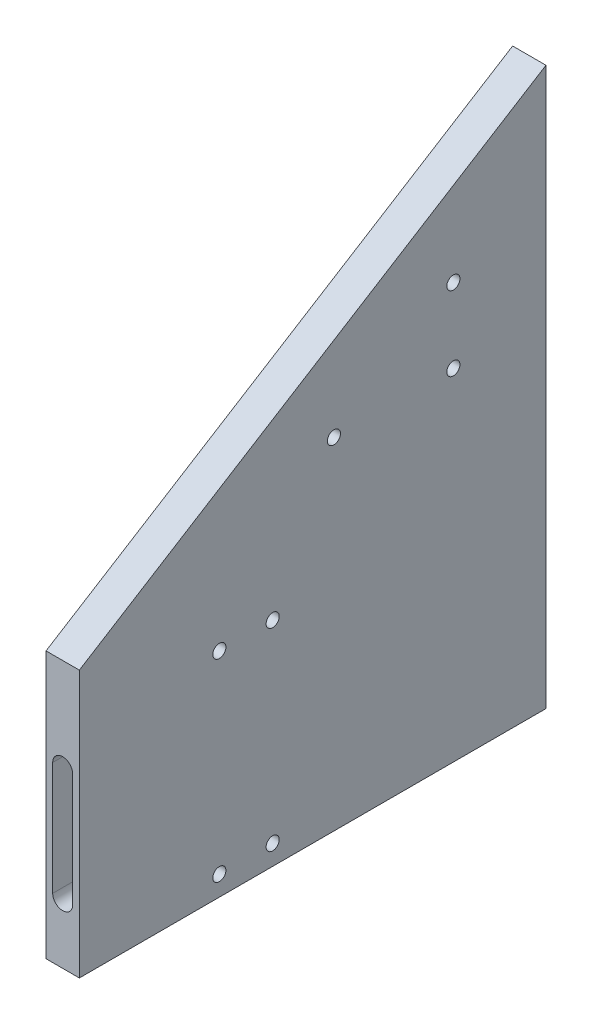
ISO-10303-21;
HEADER;
FILE_DESCRIPTION(('STEP AP214'),'2;1');
FILE_NAME('part.step','',(''),(''),'','','');
FILE_SCHEMA(('AUTOMOTIVE_DESIGN { 1 0 10303 214 1 1 1 1 }'));
ENDSEC;
DATA;
#1=APPLICATION_CONTEXT('core data for automotive mechanical design processes');
#2=APPLICATION_PROTOCOL_DEFINITION('international standard','automotive_design',2000,#1);
#3=PRODUCT_CONTEXT('',#1,'mechanical');
#4=PRODUCT('Part','Part','',(#3));
#5=PRODUCT_RELATED_PRODUCT_CATEGORY('part','',(#4));
#6=PRODUCT_DEFINITION_FORMATION('','',#4);
#7=PRODUCT_DEFINITION_CONTEXT('part definition',#1,'design');
#8=PRODUCT_DEFINITION('design','',#6,#7);
#9=PRODUCT_DEFINITION_SHAPE('','',#8);
#10=(LENGTH_UNIT() NAMED_UNIT(*) SI_UNIT(.MILLI.,.METRE.));
#11=(NAMED_UNIT(*) PLANE_ANGLE_UNIT() SI_UNIT($,.RADIAN.));
#12=(NAMED_UNIT(*) SI_UNIT($,.STERADIAN.) SOLID_ANGLE_UNIT());
#13=UNCERTAINTY_MEASURE_WITH_UNIT(LENGTH_MEASURE(1.E-05),#10,'distance_accuracy_value','');
#14=(GEOMETRIC_REPRESENTATION_CONTEXT(3) GLOBAL_UNCERTAINTY_ASSIGNED_CONTEXT((#13)) GLOBAL_UNIT_ASSIGNED_CONTEXT((#10,
#11,#12)) REPRESENTATION_CONTEXT('',''));
#15=CARTESIAN_POINT('',(0.,0.,0.));
#16=DIRECTION('',(0.,0.,1.));
#17=DIRECTION('',(1.,0.,0.));
#18=AXIS2_PLACEMENT_3D('',#15,#16,#17);
#19=CARTESIAN_POINT('',(12.7,0.,177.8));
#20=DIRECTION('',(1.,0.,0.));
#21=DIRECTION('',(0.,1.,0.));
#22=AXIS2_PLACEMENT_3D('',#19,#20,#21);
#23=PLANE('',#22);
#24=CARTESIAN_POINT('',(12.7,129.93571152044,80.7945021877174));
#25=DIRECTION('',(-1.,0.,0.));
#26=DIRECTION('',(0.,0.,1.));
#27=AXIS2_PLACEMENT_3D('',#24,#25,#26);
#28=CIRCLE('',#27,2.5);
#29=CARTESIAN_POINT('',(12.7,129.93571152044,83.2945021877174));
#30=VERTEX_POINT('',#29);
#31=EDGE_CURVE('E674',#30,#30,#28,.T.);
#32=ORIENTED_EDGE('',*,*,#31,.T.);
#33=EDGE_LOOP('',(#32));
#34=FACE_BOUND('',#33,.T.);
#35=CARTESIAN_POINT('',(12.7,158.27142304088,35.2871824836449));
#36=DIRECTION('',(-1.,0.,0.));
#37=DIRECTION('',(0.,0.,1.));
#38=AXIS2_PLACEMENT_3D('',#35,#36,#37);
#39=CIRCLE('',#38,2.5);
#40=CARTESIAN_POINT('',(12.7,158.27142304088,37.7871824836449));
#41=VERTEX_POINT('',#40);
#42=EDGE_CURVE('E679',#41,#41,#39,.T.);
#43=ORIENTED_EDGE('',*,*,#42,.T.);
#44=EDGE_LOOP('',(#43));
#45=FACE_BOUND('',#44,.T.);
#46=DIRECTION('',(0.,-1.,0.));
#47=VECTOR('',#46,1.);
#48=CARTESIAN_POINT('',(12.7,0.,0.));
#49=LINE('',#48,#47);
#50=CARTESIAN_POINT('',(12.7,212.309431825389,0.));
#51=VERTEX_POINT('',#50);
#52=CARTESIAN_POINT('',(12.7,0.,0.));
#53=VERTEX_POINT('',#52);
#54=EDGE_CURVE('E130',#51,#53,#49,.T.);
#55=ORIENTED_EDGE('',*,*,#54,.F.);
#56=DIRECTION('',(0.,0.528571428571428,-0.848888829528319));
#57=VECTOR('',#56,1.);
#58=CARTESIAN_POINT('',(12.7,152.992776280704,95.2628983994693));
#59=LINE('',#58,#57);
#60=CARTESIAN_POINT('',(12.7,101.6,177.8));
#61=VERTEX_POINT('',#60);
#62=EDGE_CURVE('E135',#61,#51,#59,.T.);
#63=ORIENTED_EDGE('',*,*,#62,.F.);
#64=DIRECTION('',(0.,-1.,0.));
#65=VECTOR('',#64,1.);
#66=CARTESIAN_POINT('',(12.7,0.,177.8));
#67=LINE('',#66,#65);
#68=CARTESIAN_POINT('',(12.7,0.,177.8));
#69=VERTEX_POINT('',#68);
#70=EDGE_CURVE('E183',#61,#69,#67,.T.);
#71=ORIENTED_EDGE('',*,*,#70,.T.);
#72=DIRECTION('',(0.,0.,-1.));
#73=VECTOR('',#72,1.);
#74=CARTESIAN_POINT('',(12.7,0.,177.8));
#75=LINE('',#74,#73);
#76=EDGE_CURVE('E11',#69,#53,#75,.T.);
#77=ORIENTED_EDGE('',*,*,#76,.T.);
#78=EDGE_LOOP('',(#55,#63,#71,#77));
#79=FACE_BOUND('',#78,.T.);
#80=CARTESIAN_POINT('',(12.7,7.62,124.46));
#81=DIRECTION('',(1.,0.,0.));
#82=DIRECTION('',(0.,0.,-1.));
#83=AXIS2_PLACEMENT_3D('',#80,#81,#82);
#84=CIRCLE('',#83,2.5);
#85=CARTESIAN_POINT('',(12.7,7.62,121.96));
#86=VERTEX_POINT('',#85);
#87=EDGE_CURVE('E244',#86,#86,#84,.T.);
#88=ORIENTED_EDGE('',*,*,#87,.F.);
#89=EDGE_LOOP('',(#88));
#90=FACE_BOUND('',#89,.T.);
#91=CARTESIAN_POINT('',(12.7,7.62,104.14));
#92=DIRECTION('',(1.,0.,0.));
#93=DIRECTION('',(0.,0.,-1.));
#94=AXIS2_PLACEMENT_3D('',#91,#92,#93);
#95=CIRCLE('',#94,2.5);
#96=CARTESIAN_POINT('',(12.7,7.62,101.64));
#97=VERTEX_POINT('',#96);
#98=EDGE_CURVE('E238',#97,#97,#95,.T.);
#99=ORIENTED_EDGE('',*,*,#98,.F.);
#100=EDGE_LOOP('',(#99));
#101=FACE_BOUND('',#100,.T.);
#102=CARTESIAN_POINT('',(12.7,81.28,124.46));
#103=DIRECTION('',(1.,0.,0.));
#104=DIRECTION('',(0.,0.,-1.));
#105=AXIS2_PLACEMENT_3D('',#102,#103,#104);
#106=CIRCLE('',#105,2.5);
#107=CARTESIAN_POINT('',(12.7,81.28,121.96));
#108=VERTEX_POINT('',#107);
#109=EDGE_CURVE('E232',#108,#108,#106,.T.);
#110=ORIENTED_EDGE('',*,*,#109,.F.);
#111=EDGE_LOOP('',(#110));
#112=FACE_BOUND('',#111,.T.);
#113=CARTESIAN_POINT('',(12.7,81.28,104.14));
#114=DIRECTION('',(1.,0.,0.));
#115=DIRECTION('',(0.,0.,-1.));
#116=AXIS2_PLACEMENT_3D('',#113,#114,#115);
#117=CIRCLE('',#116,2.5);
#118=CARTESIAN_POINT('',(12.7,81.28,101.64));
#119=VERTEX_POINT('',#118);
#120=EDGE_CURVE('E215',#119,#119,#117,.T.);
#121=ORIENTED_EDGE('',*,*,#120,.F.);
#122=EDGE_LOOP('',(#121));
#123=FACE_BOUND('',#122,.T.);
#124=CARTESIAN_POINT('',(12.7,129.93571152044,35.2871824836449));
#125=DIRECTION('',(-1.,0.,0.));
#126=DIRECTION('',(0.,0.,1.));
#127=AXIS2_PLACEMENT_3D('',#124,#125,#126);
#128=CIRCLE('',#127,2.5);
#129=CARTESIAN_POINT('',(12.7,129.93571152044,37.7871824836449));
#130=VERTEX_POINT('',#129);
#131=EDGE_CURVE('E211',#130,#130,#128,.T.);
#132=ORIENTED_EDGE('',*,*,#131,.T.);
#133=EDGE_LOOP('',(#132));
#134=FACE_BOUND('',#133,.T.);
#135=ADVANCED_FACE('F45',(#34,#45,#79,#90,#101,#112,#123,#134),#23,.T.);
#136=CARTESIAN_POINT('',(229.13180880699,147.602332213199,91.9064698280408));
#137=DIRECTION('',(0.,-0.848888829528319,-0.528571428571428));
#138=DIRECTION('',(0.,0.528571428571428,-0.848888829528319));
#139=AXIS2_PLACEMENT_3D('',#136,#137,#138);
#140=PLANE('',#139);
#141=DIRECTION('',(0.,-0.528571428571428,0.848888829528319));
#142=VECTOR('',#141,1.);
#143=CARTESIAN_POINT('',(4.445,147.602332213199,91.9064698280407));
#144=LINE('',#143,#142);
#145=CARTESIAN_POINT('',(4.445,204.82906481016,0.));
#146=VERTEX_POINT('',#145);
#147=CARTESIAN_POINT('',(4.445,101.6,165.786486486486));
#148=VERTEX_POINT('',#147);
#149=EDGE_CURVE('E69',#146,#148,#144,.T.);
#150=ORIENTED_EDGE('',*,*,#149,.F.);
#151=DIRECTION('',(-1.,0.,0.));
#152=VECTOR('',#151,1.);
#153=CARTESIAN_POINT('',(229.13180880699,204.82906481016,0.));
#154=LINE('',#153,#152);
#155=CARTESIAN_POINT('',(8.25499999999998,204.82906481016,0.));
#156=VERTEX_POINT('',#155);
#157=EDGE_CURVE('E151',#156,#146,#154,.T.);
#158=ORIENTED_EDGE('',*,*,#157,.F.);
#159=DIRECTION('',(0.,-0.528571428571428,0.848888829528319));
#160=VECTOR('',#159,1.);
#161=CARTESIAN_POINT('',(8.25499999999998,147.602332213199,91.9064698280407));
#162=LINE('',#161,#160);
#163=CARTESIAN_POINT('',(8.25500000000001,101.6,165.786486486486));
#164=VERTEX_POINT('',#163);
#165=EDGE_CURVE('E255',#156,#164,#162,.T.);
#166=ORIENTED_EDGE('',*,*,#165,.T.);
#167=DIRECTION('',(-1.,0.,0.));
#168=VECTOR('',#167,1.);
#169=CARTESIAN_POINT('',(229.13180880699,101.6,165.786486486486));
#170=LINE('',#169,#168);
#171=EDGE_CURVE('E164',#164,#148,#170,.T.);
#172=ORIENTED_EDGE('',*,*,#171,.T.);
#173=EDGE_LOOP('',(#150,#158,#166,#172));
#174=FACE_BOUND('',#173,.T.);
#175=ADVANCED_FACE('F287',(#174),#140,.T.);
#176=CARTESIAN_POINT('',(229.13180880699,101.6,0.));
#177=DIRECTION('',(0.,1.,0.));
#178=DIRECTION('',(0.,0.,1.));
#179=AXIS2_PLACEMENT_3D('',#176,#177,#178);
#180=PLANE('',#179);
#181=DIRECTION('',(0.,0.,-1.));
#182=VECTOR('',#181,1.);
#183=CARTESIAN_POINT('',(4.445,101.6,0.));
#184=LINE('',#183,#182);
#185=CARTESIAN_POINT('',(4.445,101.6,0.));
#186=VERTEX_POINT('',#185);
#187=EDGE_CURVE('E62',#148,#186,#184,.T.);
#188=ORIENTED_EDGE('',*,*,#187,.F.);
#189=ORIENTED_EDGE('',*,*,#171,.F.);
#190=DIRECTION('',(0.,0.,-1.));
#191=VECTOR('',#190,1.);
#192=CARTESIAN_POINT('',(8.25499999999999,101.6,0.));
#193=LINE('',#192,#191);
#194=CARTESIAN_POINT('',(8.25500000000001,101.6,0.));
#195=VERTEX_POINT('',#194);
#196=EDGE_CURVE('E257',#164,#195,#193,.T.);
#197=ORIENTED_EDGE('',*,*,#196,.T.);
#198=DIRECTION('',(-1.,0.,0.));
#199=VECTOR('',#198,1.);
#200=CARTESIAN_POINT('',(229.13180880699,101.6,0.));
#201=LINE('',#200,#199);
#202=EDGE_CURVE('E162',#195,#186,#201,.T.);
#203=ORIENTED_EDGE('',*,*,#202,.T.);
#204=EDGE_LOOP('',(#188,#189,#197,#203));
#205=FACE_BOUND('',#204,.T.);
#206=ADVANCED_FACE('F267',(#205),#180,.T.);
#207=CARTESIAN_POINT('',(0.,0.,177.8));
#208=DIRECTION('',(0.,-1.,0.));
#209=DIRECTION('',(0.,0.,-1.));
#210=AXIS2_PLACEMENT_3D('',#207,#208,#209);
#211=PLANE('',#210);
#212=DIRECTION('',(-1.,0.,0.));
#213=VECTOR('',#212,1.);
#214=CARTESIAN_POINT('',(0.,0.,0.));
#215=LINE('',#214,#213);
#216=CARTESIAN_POINT('',(0.,0.,0.));
#217=VERTEX_POINT('',#216);
#218=EDGE_CURVE('E141',#53,#217,#215,.T.);
#219=ORIENTED_EDGE('',*,*,#218,.F.);
#220=ORIENTED_EDGE('',*,*,#76,.F.);
#221=DIRECTION('',(-1.,0.,0.));
#222=VECTOR('',#221,1.);
#223=CARTESIAN_POINT('',(0.,0.,177.8));
#224=LINE('',#223,#222);
#225=CARTESIAN_POINT('',(0.,0.,177.8));
#226=VERTEX_POINT('',#225);
#227=EDGE_CURVE('E180',#69,#226,#224,.T.);
#228=ORIENTED_EDGE('',*,*,#227,.T.);
#229=DIRECTION('',(0.,0.,-1.));
#230=VECTOR('',#229,1.);
#231=CARTESIAN_POINT('',(0.,0.,177.8));
#232=LINE('',#231,#230);
#233=EDGE_CURVE('E54',#226,#217,#232,.T.);
#234=ORIENTED_EDGE('',*,*,#233,.T.);
#235=EDGE_LOOP('',(#219,#220,#228,#234));
#236=FACE_BOUND('',#235,.T.);
#237=ADVANCED_FACE('F302',(#236),#211,.T.);
#238=CARTESIAN_POINT('',(10.16,0.,177.8));
#239=DIRECTION('',(-1.,0.,0.));
#240=DIRECTION('',(0.,0.,1.));
#241=AXIS2_PLACEMENT_3D('',#238,#239,#240);
#242=PLANE('',#241);
#243=DIRECTION('',(0.,1.,0.));
#244=VECTOR('',#243,1.);
#245=CARTESIAN_POINT('',(10.16,0.,0.));
#246=LINE('',#245,#244);
#247=CARTESIAN_POINT('',(10.16,22.86,0.));
#248=VERTEX_POINT('',#247);
#249=CARTESIAN_POINT('',(10.16,66.04,0.));
#250=VERTEX_POINT('',#249);
#251=EDGE_CURVE('E168',#248,#250,#246,.T.);
#252=ORIENTED_EDGE('',*,*,#251,.F.);
#253=DIRECTION('',(0.,0.,-1.));
#254=VECTOR('',#253,1.);
#255=CARTESIAN_POINT('',(10.16,22.86,177.8));
#256=LINE('',#255,#254);
#257=CARTESIAN_POINT('',(10.16,22.86,177.8));
#258=VERTEX_POINT('',#257);
#259=EDGE_CURVE('E201',#258,#248,#256,.T.);
#260=ORIENTED_EDGE('',*,*,#259,.F.);
#261=DIRECTION('',(0.,1.,0.));
#262=VECTOR('',#261,1.);
#263=CARTESIAN_POINT('',(10.16,0.,177.8));
#264=LINE('',#263,#262);
#265=CARTESIAN_POINT('',(10.16,66.04,177.8));
#266=VERTEX_POINT('',#265);
#267=EDGE_CURVE('E169',#258,#266,#264,.T.);
#268=ORIENTED_EDGE('',*,*,#267,.T.);
#269=DIRECTION('',(0.,0.,-1.));
#270=VECTOR('',#269,1.);
#271=CARTESIAN_POINT('',(10.16,66.04,177.8));
#272=LINE('',#271,#270);
#273=EDGE_CURVE('E187',#266,#250,#272,.T.);
#274=ORIENTED_EDGE('',*,*,#273,.T.);
#275=EDGE_LOOP('',(#252,#260,#268,#274));
#276=FACE_BOUND('',#275,.T.);
#277=ADVANCED_FACE('F47',(#276),#242,.T.);
#278=CARTESIAN_POINT('',(6.34999999999999,22.86,177.8));
#279=DIRECTION('',(0.,0.,-1.));
#280=DIRECTION('',(-1.,0.,0.));
#281=AXIS2_PLACEMENT_3D('',#278,#279,#280);
#282=CYLINDRICAL_SURFACE('',#281,3.81);
#283=CARTESIAN_POINT('',(6.34999999999999,22.86,0.));
#284=DIRECTION('',(0.,0.,1.));
#285=DIRECTION('',(1.,0.,0.));
#286=AXIS2_PLACEMENT_3D('',#283,#284,#285);
#287=CIRCLE('',#286,3.81);
#288=CARTESIAN_POINT('',(2.54,22.86,0.));
#289=VERTEX_POINT('',#288);
#290=EDGE_CURVE('E190',#289,#248,#287,.T.);
#291=ORIENTED_EDGE('',*,*,#290,.F.);
#292=DIRECTION('',(0.,0.,-1.));
#293=VECTOR('',#292,1.);
#294=CARTESIAN_POINT('',(2.54,22.86,177.8));
#295=LINE('',#294,#293);
#296=CARTESIAN_POINT('',(2.54,22.86,177.8));
#297=VERTEX_POINT('',#296);
#298=EDGE_CURVE('E206',#297,#289,#295,.T.);
#299=ORIENTED_EDGE('',*,*,#298,.F.);
#300=CARTESIAN_POINT('',(6.34999999999999,22.86,177.8));
#301=DIRECTION('',(0.,0.,1.));
#302=DIRECTION('',(1.,0.,0.));
#303=AXIS2_PLACEMENT_3D('',#300,#301,#302);
#304=CIRCLE('',#303,3.81);
#305=EDGE_CURVE('E172',#297,#258,#304,.T.);
#306=ORIENTED_EDGE('',*,*,#305,.T.);
#307=ORIENTED_EDGE('',*,*,#259,.T.);
#308=EDGE_LOOP('',(#291,#299,#306,#307));
#309=FACE_BOUND('',#308,.T.);
#310=ADVANCED_FACE('F312',(#309),#282,.F.);
#311=CARTESIAN_POINT('',(2.54,0.,177.8));
#312=DIRECTION('',(-1.,0.,0.));
#313=DIRECTION('',(0.,0.,1.));
#314=AXIS2_PLACEMENT_3D('',#311,#312,#313);
#315=PLANE('',#314);
#316=DIRECTION('',(0.,1.,0.));
#317=VECTOR('',#316,1.);
#318=CARTESIAN_POINT('',(2.54,0.,0.));
#319=LINE('',#318,#317);
#320=CARTESIAN_POINT('',(2.54,66.04,0.));
#321=VERTEX_POINT('',#320);
#322=EDGE_CURVE('E193',#289,#321,#319,.T.);
#323=ORIENTED_EDGE('',*,*,#322,.T.);
#324=DIRECTION('',(0.,0.,-1.));
#325=VECTOR('',#324,1.);
#326=CARTESIAN_POINT('',(2.54,66.04,177.8));
#327=LINE('',#326,#325);
#328=CARTESIAN_POINT('',(2.54,66.04,177.8));
#329=VERTEX_POINT('',#328);
#330=EDGE_CURVE('E204',#329,#321,#327,.T.);
#331=ORIENTED_EDGE('',*,*,#330,.F.);
#332=DIRECTION('',(0.,1.,0.));
#333=VECTOR('',#332,1.);
#334=CARTESIAN_POINT('',(2.54,0.,177.8));
#335=LINE('',#334,#333);
#336=EDGE_CURVE('E175',#297,#329,#335,.T.);
#337=ORIENTED_EDGE('',*,*,#336,.F.);
#338=ORIENTED_EDGE('',*,*,#298,.T.);
#339=EDGE_LOOP('',(#323,#331,#337,#338));
#340=FACE_BOUND('',#339,.T.);
#341=ADVANCED_FACE('F309',(#340),#315,.F.);
#342=CARTESIAN_POINT('',(6.34999999999999,66.04,177.8));
#343=DIRECTION('',(0.,0.,-1.));
#344=DIRECTION('',(-1.,0.,0.));
#345=AXIS2_PLACEMENT_3D('',#342,#343,#344);
#346=CYLINDRICAL_SURFACE('',#345,3.81);
#347=CARTESIAN_POINT('',(6.34999999999999,66.04,0.));
#348=DIRECTION('',(0.,0.,1.));
#349=DIRECTION('',(1.,0.,0.));
#350=AXIS2_PLACEMENT_3D('',#347,#348,#349);
#351=CIRCLE('',#350,3.81);
#352=EDGE_CURVE('E196',#250,#321,#351,.T.);
#353=ORIENTED_EDGE('',*,*,#352,.F.);
#354=ORIENTED_EDGE('',*,*,#273,.F.);
#355=CARTESIAN_POINT('',(6.34999999999999,66.04,177.8));
#356=DIRECTION('',(0.,0.,1.));
#357=DIRECTION('',(1.,0.,0.));
#358=AXIS2_PLACEMENT_3D('',#355,#356,#357);
#359=CIRCLE('',#358,3.81);
#360=EDGE_CURVE('E177',#266,#329,#359,.T.);
#361=ORIENTED_EDGE('',*,*,#360,.T.);
#362=ORIENTED_EDGE('',*,*,#330,.T.);
#363=EDGE_LOOP('',(#353,#354,#361,#362));
#364=FACE_BOUND('',#363,.T.);
#365=ADVANCED_FACE('F306',(#364),#346,.F.);
#366=CARTESIAN_POINT('',(0.,0.,177.8));
#367=DIRECTION('',(-1.,0.,0.));
#368=DIRECTION('',(0.,-1.,0.));
#369=AXIS2_PLACEMENT_3D('',#366,#367,#368);
#370=PLANE('',#369);
#371=CARTESIAN_POINT('',(0.,129.93571152044,80.7945021877174));
#372=DIRECTION('',(-1.,0.,0.));
#373=DIRECTION('',(0.,0.,1.));
#374=AXIS2_PLACEMENT_3D('',#371,#372,#373);
#375=CIRCLE('',#374,2.5);
#376=CARTESIAN_POINT('',(0.,129.93571152044,83.2945021877174));
#377=VERTEX_POINT('',#376);
#378=EDGE_CURVE('E345',#377,#377,#375,.T.);
#379=ORIENTED_EDGE('',*,*,#378,.F.);
#380=EDGE_LOOP('',(#379));
#381=FACE_BOUND('',#380,.T.);
#382=CARTESIAN_POINT('',(0.,158.27142304088,35.2871824836449));
#383=DIRECTION('',(-1.,0.,0.));
#384=DIRECTION('',(0.,0.,1.));
#385=AXIS2_PLACEMENT_3D('',#382,#383,#384);
#386=CIRCLE('',#385,2.5);
#387=CARTESIAN_POINT('',(0.,158.27142304088,37.7871824836449));
#388=VERTEX_POINT('',#387);
#389=EDGE_CURVE('E349',#388,#388,#386,.T.);
#390=ORIENTED_EDGE('',*,*,#389,.F.);
#391=EDGE_LOOP('',(#390));
#392=FACE_BOUND('',#391,.T.);
#393=CARTESIAN_POINT('',(0.,129.93571152044,35.2871824836449));
#394=DIRECTION('',(-1.,0.,0.));
#395=DIRECTION('',(0.,0.,1.));
#396=AXIS2_PLACEMENT_3D('',#393,#394,#395);
#397=CIRCLE('',#396,2.5);
#398=CARTESIAN_POINT('',(0.,129.93571152044,37.7871824836449));
#399=VERTEX_POINT('',#398);
#400=EDGE_CURVE('E218',#399,#399,#397,.T.);
#401=ORIENTED_EDGE('',*,*,#400,.F.);
#402=EDGE_LOOP('',(#401));
#403=FACE_BOUND('',#402,.T.);
#404=CARTESIAN_POINT('',(0.,81.28,104.14));
#405=DIRECTION('',(1.,0.,0.));
#406=DIRECTION('',(0.,0.,-1.));
#407=AXIS2_PLACEMENT_3D('',#404,#405,#406);
#408=CIRCLE('',#407,2.5);
#409=CARTESIAN_POINT('',(0.,81.28,101.64));
#410=VERTEX_POINT('',#409);
#411=EDGE_CURVE('E229',#410,#410,#408,.T.);
#412=ORIENTED_EDGE('',*,*,#411,.T.);
#413=EDGE_LOOP('',(#412));
#414=FACE_BOUND('',#413,.T.);
#415=CARTESIAN_POINT('',(0.,81.28,124.46));
#416=DIRECTION('',(1.,0.,0.));
#417=DIRECTION('',(0.,0.,-1.));
#418=AXIS2_PLACEMENT_3D('',#415,#416,#417);
#419=CIRCLE('',#418,2.5);
#420=CARTESIAN_POINT('',(0.,81.28,121.96));
#421=VERTEX_POINT('',#420);
#422=EDGE_CURVE('E235',#421,#421,#419,.T.);
#423=ORIENTED_EDGE('',*,*,#422,.T.);
#424=EDGE_LOOP('',(#423));
#425=FACE_BOUND('',#424,.T.);
#426=CARTESIAN_POINT('',(0.,7.62,104.14));
#427=DIRECTION('',(1.,0.,0.));
#428=DIRECTION('',(0.,0.,-1.));
#429=AXIS2_PLACEMENT_3D('',#426,#427,#428);
#430=CIRCLE('',#429,2.5);
#431=CARTESIAN_POINT('',(0.,7.62,101.64));
#432=VERTEX_POINT('',#431);
#433=EDGE_CURVE('E241',#432,#432,#430,.T.);
#434=ORIENTED_EDGE('',*,*,#433,.T.);
#435=EDGE_LOOP('',(#434));
#436=FACE_BOUND('',#435,.T.);
#437=CARTESIAN_POINT('',(0.,7.62,124.46));
#438=DIRECTION('',(1.,0.,0.));
#439=DIRECTION('',(0.,0.,-1.));
#440=AXIS2_PLACEMENT_3D('',#437,#438,#439);
#441=CIRCLE('',#440,2.5);
#442=CARTESIAN_POINT('',(0.,7.62,121.96));
#443=VERTEX_POINT('',#442);
#444=EDGE_CURVE('E247',#443,#443,#441,.T.);
#445=ORIENTED_EDGE('',*,*,#444,.T.);
#446=EDGE_LOOP('',(#445));
#447=FACE_BOUND('',#446,.T.);
#448=DIRECTION('',(0.,1.,0.));
#449=VECTOR('',#448,1.);
#450=CARTESIAN_POINT('',(0.,0.,0.));
#451=LINE('',#450,#449);
#452=CARTESIAN_POINT('',(0.,212.309431825389,0.));
#453=VERTEX_POINT('',#452);
#454=EDGE_CURVE('E140',#217,#453,#451,.T.);
#455=ORIENTED_EDGE('',*,*,#454,.F.);
#456=ORIENTED_EDGE('',*,*,#233,.F.);
#457=DIRECTION('',(0.,1.,0.));
#458=VECTOR('',#457,1.);
#459=CARTESIAN_POINT('',(0.,0.,177.8));
#460=LINE('',#459,#458);
#461=CARTESIAN_POINT('',(0.,101.6,177.8));
#462=VERTEX_POINT('',#461);
#463=EDGE_CURVE('E185',#226,#462,#460,.T.);
#464=ORIENTED_EDGE('',*,*,#463,.T.);
#465=DIRECTION('',(0.,0.528571428571428,-0.848888829528319));
#466=VECTOR('',#465,1.);
#467=CARTESIAN_POINT('',(0.,152.992776280704,95.2628983994693));
#468=LINE('',#467,#466);
#469=EDGE_CURVE('E156',#462,#453,#468,.T.);
#470=ORIENTED_EDGE('',*,*,#469,.T.);
#471=EDGE_LOOP('',(#455,#456,#464,#470));
#472=FACE_BOUND('',#471,.T.);
#473=ADVANCED_FACE('F300',(#381,#392,#403,#414,#425,#436,#447,#472),#370,.T.);
#474=CARTESIAN_POINT('',(0.,0.,177.8));
#475=DIRECTION('',(0.,0.,1.));
#476=DIRECTION('',(1.,0.,0.));
#477=AXIS2_PLACEMENT_3D('',#474,#475,#476);
#478=PLANE('',#477);
#479=ORIENTED_EDGE('',*,*,#267,.F.);
#480=ORIENTED_EDGE('',*,*,#305,.F.);
#481=ORIENTED_EDGE('',*,*,#336,.T.);
#482=ORIENTED_EDGE('',*,*,#360,.F.);
#483=EDGE_LOOP('',(#479,#480,#481,#482));
#484=FACE_BOUND('',#483,.T.);
#485=ORIENTED_EDGE('',*,*,#227,.F.);
#486=ORIENTED_EDGE('',*,*,#70,.F.);
#487=DIRECTION('',(-1.,0.,0.));
#488=VECTOR('',#487,1.);
#489=CARTESIAN_POINT('',(229.13180880699,101.6,177.8));
#490=LINE('',#489,#488);
#491=EDGE_CURVE('E155',#61,#462,#490,.T.);
#492=ORIENTED_EDGE('',*,*,#491,.T.);
#493=ORIENTED_EDGE('',*,*,#463,.F.);
#494=EDGE_LOOP('',(#485,#486,#492,#493));
#495=FACE_BOUND('',#494,.T.);
#496=ADVANCED_FACE('F330',(#484,#495),#478,.T.);
#497=CARTESIAN_POINT('',(0.,0.,0.));
#498=DIRECTION('',(0.,0.,1.));
#499=DIRECTION('',(1.,0.,0.));
#500=AXIS2_PLACEMENT_3D('',#497,#498,#499);
#501=PLANE('',#500);
#502=ORIENTED_EDGE('',*,*,#454,.T.);
#503=DIRECTION('',(-1.,0.,0.));
#504=VECTOR('',#503,1.);
#505=CARTESIAN_POINT('',(229.13180880699,212.309431825389,0.));
#506=LINE('',#505,#504);
#507=EDGE_CURVE('E144',#51,#453,#506,.T.);
#508=ORIENTED_EDGE('',*,*,#507,.F.);
#509=ORIENTED_EDGE('',*,*,#54,.T.);
#510=ORIENTED_EDGE('',*,*,#218,.T.);
#511=EDGE_LOOP('',(#502,#508,#509,#510));
#512=FACE_BOUND('',#511,.T.);
#513=ORIENTED_EDGE('',*,*,#251,.T.);
#514=ORIENTED_EDGE('',*,*,#352,.T.);
#515=ORIENTED_EDGE('',*,*,#322,.F.);
#516=ORIENTED_EDGE('',*,*,#290,.T.);
#517=EDGE_LOOP('',(#513,#514,#515,#516));
#518=FACE_BOUND('',#517,.T.);
#519=ORIENTED_EDGE('',*,*,#157,.T.);
#520=DIRECTION('',(0.,-1.,0.));
#521=VECTOR('',#520,1.);
#522=CARTESIAN_POINT('',(4.445,0.,0.));
#523=LINE('',#522,#521);
#524=EDGE_CURVE('E252',#146,#186,#523,.T.);
#525=ORIENTED_EDGE('',*,*,#524,.T.);
#526=ORIENTED_EDGE('',*,*,#202,.F.);
#527=DIRECTION('',(0.,-1.,0.));
#528=VECTOR('',#527,1.);
#529=CARTESIAN_POINT('',(8.255,0.,0.));
#530=LINE('',#529,#528);
#531=EDGE_CURVE('E158',#156,#195,#530,.T.);
#532=ORIENTED_EDGE('',*,*,#531,.F.);
#533=EDGE_LOOP('',(#519,#525,#526,#532));
#534=FACE_BOUND('',#533,.T.);
#535=ADVANCED_FACE('F145',(#512,#518,#534),#501,.F.);
#536=CARTESIAN_POINT('',(229.13180880699,152.992776280704,95.2628983994693));
#537=DIRECTION('',(0.,0.848888829528319,0.528571428571428));
#538=DIRECTION('',(0.,-0.528571428571428,0.848888829528319));
#539=AXIS2_PLACEMENT_3D('',#536,#537,#538);
#540=PLANE('',#539);
#541=ORIENTED_EDGE('',*,*,#491,.F.);
#542=ORIENTED_EDGE('',*,*,#62,.T.);
#543=ORIENTED_EDGE('',*,*,#507,.T.);
#544=ORIENTED_EDGE('',*,*,#469,.F.);
#545=EDGE_LOOP('',(#541,#542,#543,#544));
#546=FACE_BOUND('',#545,.T.);
#547=ADVANCED_FACE('F153',(#546),#540,.T.);
#548=CARTESIAN_POINT('',(8.255,0.,0.));
#549=DIRECTION('',(1.,0.,0.));
#550=DIRECTION('',(0.,1.,0.));
#551=AXIS2_PLACEMENT_3D('',#548,#549,#550);
#552=PLANE('',#551);
#553=CARTESIAN_POINT('',(8.25499999999999,129.93571152044,80.7945021877174));
#554=DIRECTION('',(1.,0.,0.));
#555=DIRECTION('',(0.,1.,0.));
#556=AXIS2_PLACEMENT_3D('',#553,#554,#555);
#557=CIRCLE('',#556,2.5);
#558=CARTESIAN_POINT('',(8.25499999999999,132.43571152044,80.7945021877174));
#559=VERTEX_POINT('',#558);
#560=EDGE_CURVE('E677',#559,#559,#557,.T.);
#561=ORIENTED_EDGE('',*,*,#560,.T.);
#562=EDGE_LOOP('',(#561));
#563=FACE_BOUND('',#562,.T.);
#564=CARTESIAN_POINT('',(8.25499999999998,158.27142304088,35.2871824836449));
#565=DIRECTION('',(1.,0.,0.));
#566=DIRECTION('',(0.,1.,0.));
#567=AXIS2_PLACEMENT_3D('',#564,#565,#566);
#568=CIRCLE('',#567,2.5);
#569=CARTESIAN_POINT('',(8.25499999999998,160.77142304088,35.2871824836449));
#570=VERTEX_POINT('',#569);
#571=EDGE_CURVE('E223',#570,#570,#568,.T.);
#572=ORIENTED_EDGE('',*,*,#571,.T.);
#573=EDGE_LOOP('',(#572));
#574=FACE_BOUND('',#573,.T.);
#575=CARTESIAN_POINT('',(8.25499999999999,129.93571152044,35.2871824836449));
#576=DIRECTION('',(1.,0.,0.));
#577=DIRECTION('',(0.,1.,0.));
#578=AXIS2_PLACEMENT_3D('',#575,#576,#577);
#579=CIRCLE('',#578,2.5);
#580=CARTESIAN_POINT('',(8.25499999999999,132.43571152044,35.2871824836449));
#581=VERTEX_POINT('',#580);
#582=EDGE_CURVE('E210',#581,#581,#579,.T.);
#583=ORIENTED_EDGE('',*,*,#582,.T.);
#584=EDGE_LOOP('',(#583));
#585=FACE_BOUND('',#584,.T.);
#586=ORIENTED_EDGE('',*,*,#165,.F.);
#587=ORIENTED_EDGE('',*,*,#531,.T.);
#588=ORIENTED_EDGE('',*,*,#196,.F.);
#589=EDGE_LOOP('',(#586,#587,#588));
#590=FACE_BOUND('',#589,.T.);
#591=ADVANCED_FACE('F263',(#563,#574,#585,#590),#552,.F.);
#592=CARTESIAN_POINT('',(4.445,0.,0.));
#593=DIRECTION('',(1.,0.,0.));
#594=DIRECTION('',(0.,0.,-1.));
#595=AXIS2_PLACEMENT_3D('',#592,#593,#594);
#596=PLANE('',#595);
#597=CARTESIAN_POINT('',(4.445,129.93571152044,80.7945021877174));
#598=DIRECTION('',(1.,0.,0.));
#599=DIRECTION('',(0.,0.,-1.));
#600=AXIS2_PLACEMENT_3D('',#597,#598,#599);
#601=CIRCLE('',#600,2.5);
#602=CARTESIAN_POINT('',(4.445,129.93571152044,78.2945021877174));
#603=VERTEX_POINT('',#602);
#604=EDGE_CURVE('E49',#603,#603,#601,.T.);
#605=ORIENTED_EDGE('',*,*,#604,.F.);
#606=EDGE_LOOP('',(#605));
#607=FACE_BOUND('',#606,.T.);
#608=CARTESIAN_POINT('',(4.445,158.27142304088,35.2871824836449));
#609=DIRECTION('',(1.,0.,0.));
#610=DIRECTION('',(0.,0.,-1.));
#611=AXIS2_PLACEMENT_3D('',#608,#609,#610);
#612=CIRCLE('',#611,2.5);
#613=CARTESIAN_POINT('',(4.445,158.27142304088,32.7871824836449));
#614=VERTEX_POINT('',#613);
#615=EDGE_CURVE('E687',#614,#614,#612,.T.);
#616=ORIENTED_EDGE('',*,*,#615,.F.);
#617=EDGE_LOOP('',(#616));
#618=FACE_BOUND('',#617,.T.);
#619=CARTESIAN_POINT('',(4.445,129.93571152044,35.2871824836449));
#620=DIRECTION('',(1.,0.,0.));
#621=DIRECTION('',(0.,0.,-1.));
#622=AXIS2_PLACEMENT_3D('',#619,#620,#621);
#623=CIRCLE('',#622,2.5);
#624=CARTESIAN_POINT('',(4.445,129.93571152044,32.7871824836449));
#625=VERTEX_POINT('',#624);
#626=EDGE_CURVE('E208',#625,#625,#623,.T.);
#627=ORIENTED_EDGE('',*,*,#626,.F.);
#628=EDGE_LOOP('',(#627));
#629=FACE_BOUND('',#628,.T.);
#630=ORIENTED_EDGE('',*,*,#149,.T.);
#631=ORIENTED_EDGE('',*,*,#187,.T.);
#632=ORIENTED_EDGE('',*,*,#524,.F.);
#633=EDGE_LOOP('',(#630,#631,#632));
#634=FACE_BOUND('',#633,.T.);
#635=ADVANCED_FACE('F269',(#607,#618,#629,#634),#596,.T.);
#636=CARTESIAN_POINT('',(12.7,7.62,124.46));
#637=DIRECTION('',(1.,0.,0.));
#638=DIRECTION('',(0.,0.,-1.));
#639=AXIS2_PLACEMENT_3D('',#636,#637,#638);
#640=CYLINDRICAL_SURFACE('',#639,2.5);
#641=ORIENTED_EDGE('',*,*,#444,.F.);
#642=EDGE_LOOP('',(#641));
#643=FACE_BOUND('',#642,.T.);
#644=ORIENTED_EDGE('',*,*,#87,.T.);
#645=EDGE_LOOP('',(#644));
#646=FACE_BOUND('',#645,.T.);
#647=ADVANCED_FACE('F271',(#643,#646),#640,.F.);
#648=CARTESIAN_POINT('',(12.7,7.62,104.14));
#649=DIRECTION('',(1.,0.,0.));
#650=DIRECTION('',(0.,0.,-1.));
#651=AXIS2_PLACEMENT_3D('',#648,#649,#650);
#652=CYLINDRICAL_SURFACE('',#651,2.5);
#653=ORIENTED_EDGE('',*,*,#433,.F.);
#654=EDGE_LOOP('',(#653));
#655=FACE_BOUND('',#654,.T.);
#656=ORIENTED_EDGE('',*,*,#98,.T.);
#657=EDGE_LOOP('',(#656));
#658=FACE_BOUND('',#657,.T.);
#659=ADVANCED_FACE('F279',(#655,#658),#652,.F.);
#660=CARTESIAN_POINT('',(12.7,81.28,124.46));
#661=DIRECTION('',(1.,0.,0.));
#662=DIRECTION('',(0.,0.,-1.));
#663=AXIS2_PLACEMENT_3D('',#660,#661,#662);
#664=CYLINDRICAL_SURFACE('',#663,2.5);
#665=ORIENTED_EDGE('',*,*,#422,.F.);
#666=EDGE_LOOP('',(#665));
#667=FACE_BOUND('',#666,.T.);
#668=ORIENTED_EDGE('',*,*,#109,.T.);
#669=EDGE_LOOP('',(#668));
#670=FACE_BOUND('',#669,.T.);
#671=ADVANCED_FACE('F371',(#667,#670),#664,.F.);
#672=CARTESIAN_POINT('',(12.7,81.28,104.14));
#673=DIRECTION('',(1.,0.,0.));
#674=DIRECTION('',(0.,0.,-1.));
#675=AXIS2_PLACEMENT_3D('',#672,#673,#674);
#676=CYLINDRICAL_SURFACE('',#675,2.5);
#677=ORIENTED_EDGE('',*,*,#411,.F.);
#678=EDGE_LOOP('',(#677));
#679=FACE_BOUND('',#678,.T.);
#680=ORIENTED_EDGE('',*,*,#120,.T.);
#681=EDGE_LOOP('',(#680));
#682=FACE_BOUND('',#681,.T.);
#683=ADVANCED_FACE('F368',(#679,#682),#676,.F.);
#684=CARTESIAN_POINT('',(0.,129.93571152044,35.2871824836449));
#685=DIRECTION('',(-1.,0.,0.));
#686=DIRECTION('',(0.,0.,1.));
#687=AXIS2_PLACEMENT_3D('',#684,#685,#686);
#688=CYLINDRICAL_SURFACE('',#687,2.5);
#689=ORIENTED_EDGE('',*,*,#626,.T.);
#690=EDGE_LOOP('',(#689));
#691=FACE_BOUND('',#690,.T.);
#692=ORIENTED_EDGE('',*,*,#400,.T.);
#693=EDGE_LOOP('',(#692));
#694=FACE_BOUND('',#693,.T.);
#695=ADVANCED_FACE('F370',(#691,#694),#688,.F.);
#696=ORIENTED_EDGE('',*,*,#131,.F.);
#697=EDGE_LOOP('',(#696));
#698=FACE_BOUND('',#697,.T.);
#699=ORIENTED_EDGE('',*,*,#582,.F.);
#700=EDGE_LOOP('',(#699));
#701=FACE_BOUND('',#700,.T.);
#702=ADVANCED_FACE('F378',(#698,#701),#688,.F.);
#703=CARTESIAN_POINT('',(0.,158.27142304088,35.2871824836449));
#704=DIRECTION('',(-1.,0.,0.));
#705=DIRECTION('',(0.,0.,1.));
#706=AXIS2_PLACEMENT_3D('',#703,#704,#705);
#707=CYLINDRICAL_SURFACE('',#706,2.5);
#708=ORIENTED_EDGE('',*,*,#42,.F.);
#709=EDGE_LOOP('',(#708));
#710=FACE_BOUND('',#709,.T.);
#711=ORIENTED_EDGE('',*,*,#571,.F.);
#712=EDGE_LOOP('',(#711));
#713=FACE_BOUND('',#712,.T.);
#714=ADVANCED_FACE('F421',(#710,#713),#707,.F.);
#715=ORIENTED_EDGE('',*,*,#615,.T.);
#716=EDGE_LOOP('',(#715));
#717=FACE_BOUND('',#716,.T.);
#718=ORIENTED_EDGE('',*,*,#389,.T.);
#719=EDGE_LOOP('',(#718));
#720=FACE_BOUND('',#719,.T.);
#721=ADVANCED_FACE('F418',(#717,#720),#707,.F.);
#722=CARTESIAN_POINT('',(0.,129.93571152044,80.7945021877174));
#723=DIRECTION('',(-1.,0.,0.));
#724=DIRECTION('',(0.,0.,1.));
#725=AXIS2_PLACEMENT_3D('',#722,#723,#724);
#726=CYLINDRICAL_SURFACE('',#725,2.5);
#727=ORIENTED_EDGE('',*,*,#604,.T.);
#728=EDGE_LOOP('',(#727));
#729=FACE_BOUND('',#728,.T.);
#730=ORIENTED_EDGE('',*,*,#378,.T.);
#731=EDGE_LOOP('',(#730));
#732=FACE_BOUND('',#731,.T.);
#733=ADVANCED_FACE('F420',(#729,#732),#726,.F.);
#734=ORIENTED_EDGE('',*,*,#31,.F.);
#735=EDGE_LOOP('',(#734));
#736=FACE_BOUND('',#735,.T.);
#737=ORIENTED_EDGE('',*,*,#560,.F.);
#738=EDGE_LOOP('',(#737));
#739=FACE_BOUND('',#738,.T.);
#740=ADVANCED_FACE('F432',(#736,#739),#726,.F.);
#741=CLOSED_SHELL('',(#135,#175,#206,#237,#277,#310,#341,#365,#473,#496,#535,#547,#591,#635,
#647,#659,#671,#683,#695,#702,#714,#721,#733,#740));
#742=MANIFOLD_SOLID_BREP('B2',#741);
#743=ADVANCED_BREP_SHAPE_REPRESENTATION('',(#18,#742),#14);
#744=SHAPE_DEFINITION_REPRESENTATION(#9,#743);
ENDSEC;
END-ISO-10303-21;
